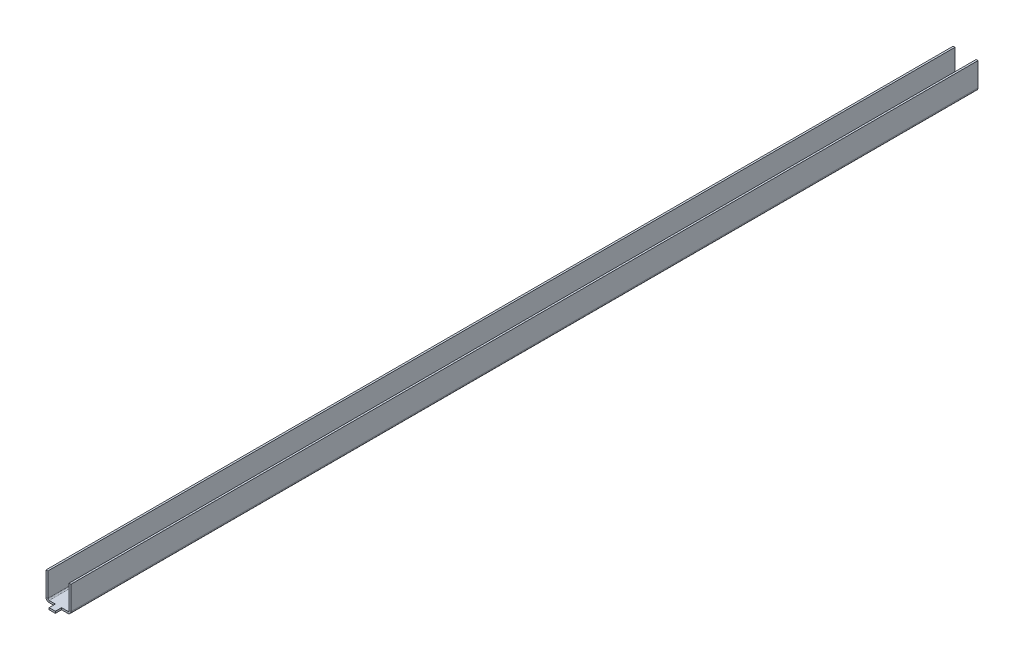
ISO-10303-21;
HEADER;
FILE_DESCRIPTION(('STEP AP214'),'2;1');
FILE_NAME('part.step','',(''),(''),'','','');
FILE_SCHEMA(('AUTOMOTIVE_DESIGN { 1 0 10303 214 1 1 1 1 }'));
ENDSEC;
DATA;
#1=APPLICATION_CONTEXT('core data for automotive mechanical design processes');
#2=APPLICATION_PROTOCOL_DEFINITION('international standard','automotive_design',2000,#1);
#3=PRODUCT_CONTEXT('',#1,'mechanical');
#4=PRODUCT('Part','Part','',(#3));
#5=PRODUCT_RELATED_PRODUCT_CATEGORY('part','',(#4));
#6=PRODUCT_DEFINITION_FORMATION('','',#4);
#7=PRODUCT_DEFINITION_CONTEXT('part definition',#1,'design');
#8=PRODUCT_DEFINITION('design','',#6,#7);
#9=PRODUCT_DEFINITION_SHAPE('','',#8);
#10=(LENGTH_UNIT() NAMED_UNIT(*) SI_UNIT(.MILLI.,.METRE.));
#11=(NAMED_UNIT(*) PLANE_ANGLE_UNIT() SI_UNIT($,.RADIAN.));
#12=(NAMED_UNIT(*) SI_UNIT($,.STERADIAN.) SOLID_ANGLE_UNIT());
#13=UNCERTAINTY_MEASURE_WITH_UNIT(LENGTH_MEASURE(1.E-05),#10,'distance_accuracy_value','');
#14=(GEOMETRIC_REPRESENTATION_CONTEXT(3) GLOBAL_UNCERTAINTY_ASSIGNED_CONTEXT((#13)) GLOBAL_UNIT_ASSIGNED_CONTEXT((#10,
#11,#12)) REPRESENTATION_CONTEXT('',''));
#15=CARTESIAN_POINT('',(0.,0.,0.));
#16=DIRECTION('',(0.,0.,1.));
#17=DIRECTION('',(1.,0.,0.));
#18=AXIS2_PLACEMENT_3D('',#15,#16,#17);
#19=CARTESIAN_POINT('',(1448.99545453837,-1.50000000000008,-26.7842712474617));
#20=DIRECTION('',(0.,1.,0.));
#21=DIRECTION('',(-1.,0.,0.));
#22=AXIS2_PLACEMENT_3D('',#19,#20,#21);
#23=PLANE('',#22);
#24=DIRECTION('',(-1.,0.,0.));
#25=VECTOR('',#24,1.);
#26=CARTESIAN_POINT('',(1448.99545453837,-1.50000000000008,1.5));
#27=LINE('',#26,#25);
#28=CARTESIAN_POINT('',(-8.49999999999999,-1.49999999999983,1.5));
#29=VERTEX_POINT('',#28);
#30=CARTESIAN_POINT('',(-9.99999999999958,-1.49999999999983,1.5));
#31=VERTEX_POINT('',#30);
#32=EDGE_CURVE('E107',#29,#31,#27,.T.);
#33=ORIENTED_EDGE('',*,*,#32,.T.);
#34=DIRECTION('',(0.,0.,1.));
#35=VECTOR('',#34,1.);
#36=CARTESIAN_POINT('',(-9.99999999999998,-1.49999999999983,-26.7842712474617));
#37=LINE('',#36,#35);
#38=CARTESIAN_POINT('',(-9.99999999999998,-1.49999999999983,730.));
#39=VERTEX_POINT('',#38);
#40=EDGE_CURVE('E561',#31,#39,#37,.T.);
#41=ORIENTED_EDGE('',*,*,#40,.T.);
#42=DIRECTION('',(-1.,0.,0.));
#43=VECTOR('',#42,1.);
#44=CARTESIAN_POINT('',(1448.99545453837,-1.50000000000008,730.));
#45=LINE('',#44,#43);
#46=CARTESIAN_POINT('',(-8.49999999999952,-1.49999999999983,730.));
#47=VERTEX_POINT('',#46);
#48=EDGE_CURVE('E400',#47,#39,#45,.T.);
#49=ORIENTED_EDGE('',*,*,#48,.F.);
#50=DIRECTION('',(0.,0.,1.));
#51=VECTOR('',#50,1.);
#52=CARTESIAN_POINT('',(-8.49999999999999,-1.49999999999983,-26.7842712474617));
#53=LINE('',#52,#51);
#54=EDGE_CURVE('E559',#47,#29,#53,.F.);
#55=ORIENTED_EDGE('',*,*,#54,.T.);
#56=EDGE_LOOP('',(#33,#41,#49,#55));
#57=FACE_BOUND('',#56,.T.);
#58=ADVANCED_FACE('F53',(#57),#23,.T.);
#59=CARTESIAN_POINT('',(1448.99545453837,-1.50000000000008,1.5));
#60=DIRECTION('',(0.,0.,-1.));
#61=DIRECTION('',(1.,0.,0.));
#62=AXIS2_PLACEMENT_3D('',#59,#60,#61);
#63=PLANE('',#62);
#64=DIRECTION('',(-1.,0.,0.));
#65=VECTOR('',#64,1.);
#66=CARTESIAN_POINT('',(1448.99545453837,-20.5000000000001,1.49999999999997));
#67=LINE('',#66,#65);
#68=CARTESIAN_POINT('',(-8.49999999999952,-20.4999999999998,1.49999999999997));
#69=VERTEX_POINT('',#68);
#70=CARTESIAN_POINT('',(-9.99999999999999,-20.4999999999998,1.49999999999995));
#71=VERTEX_POINT('',#70);
#72=EDGE_CURVE('E557',#69,#71,#67,.T.);
#73=ORIENTED_EDGE('',*,*,#72,.T.);
#74=DIRECTION('',(0.,-1.,0.));
#75=VECTOR('',#74,1.);
#76=CARTESIAN_POINT('',(-9.99999999999998,-1.49999999999993,1.5));
#77=LINE('',#76,#75);
#78=EDGE_CURVE('E403',#31,#71,#77,.T.);
#79=ORIENTED_EDGE('',*,*,#78,.F.);
#80=ORIENTED_EDGE('',*,*,#32,.F.);
#81=DIRECTION('',(0.,-1.,0.));
#82=VECTOR('',#81,1.);
#83=CARTESIAN_POINT('',(-8.49999999999999,-1.49999999999983,1.5));
#84=LINE('',#83,#82);
#85=EDGE_CURVE('E104',#29,#69,#84,.T.);
#86=ORIENTED_EDGE('',*,*,#85,.T.);
#87=EDGE_LOOP('',(#73,#79,#80,#86));
#88=FACE_BOUND('',#87,.T.);
#89=ADVANCED_FACE('F598',(#88),#63,.T.);
#90=CARTESIAN_POINT('',(-9.99999999999998,-1.49999999999983,-26.7842712474617));
#91=DIRECTION('',(-1.,0.,0.));
#92=DIRECTION('',(0.,-1.,0.));
#93=AXIS2_PLACEMENT_3D('',#90,#91,#92);
#94=PLANE('',#93);
#95=DIRECTION('',(0.,0.,1.));
#96=VECTOR('',#95,1.);
#97=CARTESIAN_POINT('',(-9.99999999999999,-20.4999999999998,-26.7842712474617));
#98=LINE('',#97,#96);
#99=CARTESIAN_POINT('',(-9.99999999999999,-20.4999999999998,730.));
#100=VERTEX_POINT('',#99);
#101=EDGE_CURVE('E272',#100,#71,#98,.F.);
#102=ORIENTED_EDGE('',*,*,#101,.F.);
#103=DIRECTION('',(0.,1.,0.));
#104=VECTOR('',#103,1.);
#105=CARTESIAN_POINT('',(-9.99999999999999,-19.9999999999998,730.));
#106=LINE('',#105,#104);
#107=EDGE_CURVE('E397',#39,#100,#106,.F.);
#108=ORIENTED_EDGE('',*,*,#107,.F.);
#109=ORIENTED_EDGE('',*,*,#40,.F.);
#110=ORIENTED_EDGE('',*,*,#78,.T.);
#111=EDGE_LOOP('',(#102,#108,#109,#110));
#112=FACE_BOUND('',#111,.T.);
#113=ADVANCED_FACE('F597',(#112),#94,.T.);
#114=CARTESIAN_POINT('',(1448.99545453837,-1.50000000000008,730.));
#115=DIRECTION('',(0.,0.,1.));
#116=DIRECTION('',(-1.,0.,0.));
#117=AXIS2_PLACEMENT_3D('',#114,#115,#116);
#118=PLANE('',#117);
#119=ORIENTED_EDGE('',*,*,#48,.T.);
#120=ORIENTED_EDGE('',*,*,#107,.T.);
#121=DIRECTION('',(-1.,0.,0.));
#122=VECTOR('',#121,1.);
#123=CARTESIAN_POINT('',(1448.99545453837,-20.5000000000001,730.));
#124=LINE('',#123,#122);
#125=CARTESIAN_POINT('',(-8.49999999999952,-20.4999999999998,730.));
#126=VERTEX_POINT('',#125);
#127=EDGE_CURVE('E58',#126,#100,#124,.T.);
#128=ORIENTED_EDGE('',*,*,#127,.F.);
#129=DIRECTION('',(0.,-1.,0.));
#130=VECTOR('',#129,1.);
#131=CARTESIAN_POINT('',(-8.49999999999999,-1.49999999999983,730.));
#132=LINE('',#131,#130);
#133=EDGE_CURVE('E65',#126,#47,#132,.F.);
#134=ORIENTED_EDGE('',*,*,#133,.T.);
#135=EDGE_LOOP('',(#119,#120,#128,#134));
#136=FACE_BOUND('',#135,.T.);
#137=ADVANCED_FACE('F591',(#136),#118,.T.);
#138=CARTESIAN_POINT('',(-8.49999999999999,-1.49999999999983,-26.7842712474617));
#139=DIRECTION('',(-1.,0.,0.));
#140=DIRECTION('',(0.,-1.,0.));
#141=AXIS2_PLACEMENT_3D('',#138,#139,#140);
#142=PLANE('',#141);
#143=ORIENTED_EDGE('',*,*,#54,.F.);
#144=ORIENTED_EDGE('',*,*,#133,.F.);
#145=DIRECTION('',(0.,0.,1.));
#146=VECTOR('',#145,1.);
#147=CARTESIAN_POINT('',(-8.49999999999999,-20.4999999999998,-26.7842712474617));
#148=LINE('',#147,#146);
#149=EDGE_CURVE('E12',#126,#69,#148,.F.);
#150=ORIENTED_EDGE('',*,*,#149,.T.);
#151=ORIENTED_EDGE('',*,*,#85,.F.);
#152=EDGE_LOOP('',(#143,#144,#150,#151));
#153=FACE_BOUND('',#152,.T.);
#154=ADVANCED_FACE('F56',(#153),#142,.F.);
#155=CARTESIAN_POINT('',(10.,-22.9999999999998,-26.7842712474617));
#156=DIRECTION('',(0.,-1.,0.));
#157=DIRECTION('',(0.,0.,-1.));
#158=AXIS2_PLACEMENT_3D('',#155,#156,#157);
#159=PLANE('',#158);
#160=DIRECTION('',(0.,0.,1.));
#161=VECTOR('',#160,1.);
#162=CARTESIAN_POINT('',(7.5,-22.9999999999998,-26.7842712474617));
#163=LINE('',#162,#161);
#164=CARTESIAN_POINT('',(7.5,-22.9999999999998,730.));
#165=VERTEX_POINT('',#164);
#166=CARTESIAN_POINT('',(7.49999999999999,-22.9999999999998,1.49999999999995));
#167=VERTEX_POINT('',#166);
#168=EDGE_CURVE('E442',#165,#167,#163,.F.);
#169=ORIENTED_EDGE('',*,*,#168,.F.);
#170=DIRECTION('',(1.,0.,0.));
#171=VECTOR('',#170,1.);
#172=CARTESIAN_POINT('',(8.5,-22.9999999999998,730.));
#173=LINE('',#172,#171);
#174=CARTESIAN_POINT('',(2.5,-22.9999999999998,730.));
#175=VERTEX_POINT('',#174);
#176=EDGE_CURVE('E445',#175,#165,#173,.T.);
#177=ORIENTED_EDGE('',*,*,#176,.F.);
#178=DIRECTION('',(0.,0.,1.));
#179=VECTOR('',#178,1.);
#180=CARTESIAN_POINT('',(2.5,-22.9999999999998,730.));
#181=LINE('',#180,#179);
#182=CARTESIAN_POINT('',(2.5,-22.9999999999998,735.));
#183=VERTEX_POINT('',#182);
#184=EDGE_CURVE('E450',#175,#183,#181,.T.);
#185=ORIENTED_EDGE('',*,*,#184,.T.);
#186=DIRECTION('',(-1.,0.,0.));
#187=VECTOR('',#186,1.);
#188=CARTESIAN_POINT('',(2.5,-22.9999999999998,735.));
#189=LINE('',#188,#187);
#190=CARTESIAN_POINT('',(-2.5,-22.9999999999998,735.));
#191=VERTEX_POINT('',#190);
#192=EDGE_CURVE('E465',#183,#191,#189,.T.);
#193=ORIENTED_EDGE('',*,*,#192,.T.);
#194=DIRECTION('',(0.,0.,-1.));
#195=VECTOR('',#194,1.);
#196=CARTESIAN_POINT('',(-2.5,-22.9999999999998,730.));
#197=LINE('',#196,#195);
#198=CARTESIAN_POINT('',(-2.5,-22.9999999999998,730.));
#199=VERTEX_POINT('',#198);
#200=EDGE_CURVE('E462',#191,#199,#197,.T.);
#201=ORIENTED_EDGE('',*,*,#200,.T.);
#202=CARTESIAN_POINT('',(-7.5,-22.9999999999998,730.));
#203=VERTEX_POINT('',#202);
#204=EDGE_CURVE('E284',#203,#199,#173,.T.);
#205=ORIENTED_EDGE('',*,*,#204,.F.);
#206=DIRECTION('',(0.,0.,-1.));
#207=VECTOR('',#206,1.);
#208=CARTESIAN_POINT('',(-7.5,-22.9999999999998,-26.7842712474617));
#209=LINE('',#208,#207);
#210=CARTESIAN_POINT('',(-7.5,-22.9999999999998,1.49999999999995));
#211=VERTEX_POINT('',#210);
#212=EDGE_CURVE('E269',#203,#211,#209,.T.);
#213=ORIENTED_EDGE('',*,*,#212,.T.);
#214=DIRECTION('',(1.,0.,0.));
#215=VECTOR('',#214,1.);
#216=CARTESIAN_POINT('',(10.,-22.9999999999998,1.49999999999994));
#217=LINE('',#216,#215);
#218=CARTESIAN_POINT('',(-2.5,-22.9999999999998,1.49999999999994));
#219=VERTEX_POINT('',#218);
#220=EDGE_CURVE('E281',#211,#219,#217,.T.);
#221=ORIENTED_EDGE('',*,*,#220,.T.);
#222=DIRECTION('',(0.,0.,-1.));
#223=VECTOR('',#222,1.);
#224=CARTESIAN_POINT('',(-2.5,-22.9999999999998,1.49999999999993));
#225=LINE('',#224,#223);
#226=CARTESIAN_POINT('',(-2.5,-22.9999999999998,-2.61726404438001E-13));
#227=VERTEX_POINT('',#226);
#228=EDGE_CURVE('E292',#219,#227,#225,.T.);
#229=ORIENTED_EDGE('',*,*,#228,.T.);
#230=DIRECTION('',(1.,0.,0.));
#231=VECTOR('',#230,1.);
#232=CARTESIAN_POINT('',(2.5,-22.9999999999998,-2.61075883134509E-13));
#233=LINE('',#232,#231);
#234=CARTESIAN_POINT('',(2.5,-22.9999999999998,-2.61075883134509E-13));
#235=VERTEX_POINT('',#234);
#236=EDGE_CURVE('E296',#227,#235,#233,.T.);
#237=ORIENTED_EDGE('',*,*,#236,.T.);
#238=DIRECTION('',(0.,0.,1.));
#239=VECTOR('',#238,1.);
#240=CARTESIAN_POINT('',(2.5,-22.9999999999998,1.49999999999994));
#241=LINE('',#240,#239);
#242=CARTESIAN_POINT('',(2.5,-22.9999999999998,1.49999999999994));
#243=VERTEX_POINT('',#242);
#244=EDGE_CURVE('E302',#235,#243,#241,.T.);
#245=ORIENTED_EDGE('',*,*,#244,.T.);
#246=EDGE_CURVE('E294',#243,#167,#217,.T.);
#247=ORIENTED_EDGE('',*,*,#246,.T.);
#248=EDGE_LOOP('',(#169,#177,#185,#193,#201,#205,#213,#221,#229,#237,#245,#247));
#249=FACE_BOUND('',#248,.T.);
#250=ADVANCED_FACE('F280',(#249),#159,.T.);
#251=CARTESIAN_POINT('',(10.,1448.80609058114,730.));
#252=DIRECTION('',(0.,0.,1.));
#253=DIRECTION('',(0.,-1.,0.));
#254=AXIS2_PLACEMENT_3D('',#251,#252,#253);
#255=PLANE('',#254);
#256=DIRECTION('',(0.,-1.,0.));
#257=VECTOR('',#256,1.);
#258=CARTESIAN_POINT('',(-7.5,1448.80609058114,730.));
#259=LINE('',#258,#257);
#260=CARTESIAN_POINT('',(-7.5,-21.4999999999998,730.));
#261=VERTEX_POINT('',#260);
#262=EDGE_CURVE('E392',#261,#203,#259,.T.);
#263=ORIENTED_EDGE('',*,*,#262,.T.);
#264=ORIENTED_EDGE('',*,*,#204,.T.);
#265=DIRECTION('',(0.,-1.,0.));
#266=VECTOR('',#265,1.);
#267=CARTESIAN_POINT('',(-2.5,1448.80609058114,730.));
#268=LINE('',#267,#266);
#269=CARTESIAN_POINT('',(-2.5,-21.4999999999998,730.));
#270=VERTEX_POINT('',#269);
#271=EDGE_CURVE('E389',#270,#199,#268,.T.);
#272=ORIENTED_EDGE('',*,*,#271,.F.);
#273=DIRECTION('',(1.,0.,0.));
#274=VECTOR('',#273,1.);
#275=CARTESIAN_POINT('',(10.,-21.4999999999998,730.));
#276=LINE('',#275,#274);
#277=EDGE_CURVE('E307',#270,#261,#276,.F.);
#278=ORIENTED_EDGE('',*,*,#277,.T.);
#279=EDGE_LOOP('',(#263,#264,#272,#278));
#280=FACE_BOUND('',#279,.T.);
#281=ADVANCED_FACE('F578',(#280),#255,.T.);
#282=CARTESIAN_POINT('',(-2.5,1448.80609058114,730.));
#283=DIRECTION('',(-1.,0.,0.));
#284=DIRECTION('',(0.,-1.,0.));
#285=AXIS2_PLACEMENT_3D('',#282,#283,#284);
#286=PLANE('',#285);
#287=ORIENTED_EDGE('',*,*,#271,.T.);
#288=ORIENTED_EDGE('',*,*,#200,.F.);
#289=DIRECTION('',(0.,-1.,0.));
#290=VECTOR('',#289,1.);
#291=CARTESIAN_POINT('',(-2.5,1448.80609058114,735.));
#292=LINE('',#291,#290);
#293=CARTESIAN_POINT('',(-2.5,-21.4999999999998,735.));
#294=VERTEX_POINT('',#293);
#295=EDGE_CURVE('E386',#294,#191,#292,.T.);
#296=ORIENTED_EDGE('',*,*,#295,.F.);
#297=DIRECTION('',(0.,0.,-1.));
#298=VECTOR('',#297,1.);
#299=CARTESIAN_POINT('',(-2.5,-21.4999999999998,730.));
#300=LINE('',#299,#298);
#301=EDGE_CURVE('E119',#294,#270,#300,.T.);
#302=ORIENTED_EDGE('',*,*,#301,.T.);
#303=EDGE_LOOP('',(#287,#288,#296,#302));
#304=FACE_BOUND('',#303,.T.);
#305=ADVANCED_FACE('F620',(#304),#286,.T.);
#306=CARTESIAN_POINT('',(2.5,1448.80609058114,735.));
#307=DIRECTION('',(0.,0.,1.));
#308=DIRECTION('',(0.,-1.,0.));
#309=AXIS2_PLACEMENT_3D('',#306,#307,#308);
#310=PLANE('',#309);
#311=ORIENTED_EDGE('',*,*,#295,.T.);
#312=ORIENTED_EDGE('',*,*,#192,.F.);
#313=DIRECTION('',(0.,-1.,0.));
#314=VECTOR('',#313,1.);
#315=CARTESIAN_POINT('',(2.5,1448.80609058114,735.));
#316=LINE('',#315,#314);
#317=CARTESIAN_POINT('',(2.5,-21.4999999999998,735.));
#318=VERTEX_POINT('',#317);
#319=EDGE_CURVE('E382',#318,#183,#316,.T.);
#320=ORIENTED_EDGE('',*,*,#319,.F.);
#321=DIRECTION('',(-1.,0.,0.));
#322=VECTOR('',#321,1.);
#323=CARTESIAN_POINT('',(2.5,-21.4999999999998,735.));
#324=LINE('',#323,#322);
#325=EDGE_CURVE('E129',#318,#294,#324,.T.);
#326=ORIENTED_EDGE('',*,*,#325,.T.);
#327=EDGE_LOOP('',(#311,#312,#320,#326));
#328=FACE_BOUND('',#327,.T.);
#329=ADVANCED_FACE('F650',(#328),#310,.T.);
#330=CARTESIAN_POINT('',(2.5,1448.80609058114,730.));
#331=DIRECTION('',(1.,0.,0.));
#332=DIRECTION('',(0.,1.,0.));
#333=AXIS2_PLACEMENT_3D('',#330,#331,#332);
#334=PLANE('',#333);
#335=ORIENTED_EDGE('',*,*,#319,.T.);
#336=ORIENTED_EDGE('',*,*,#184,.F.);
#337=DIRECTION('',(0.,-1.,0.));
#338=VECTOR('',#337,1.);
#339=CARTESIAN_POINT('',(2.5,1448.80609058114,730.));
#340=LINE('',#339,#338);
#341=CARTESIAN_POINT('',(2.5,-21.4999999999998,730.));
#342=VERTEX_POINT('',#341);
#343=EDGE_CURVE('E378',#342,#175,#340,.T.);
#344=ORIENTED_EDGE('',*,*,#343,.F.);
#345=DIRECTION('',(0.,0.,1.));
#346=VECTOR('',#345,1.);
#347=CARTESIAN_POINT('',(2.5,-21.4999999999998,730.));
#348=LINE('',#347,#346);
#349=EDGE_CURVE('E331',#342,#318,#348,.T.);
#350=ORIENTED_EDGE('',*,*,#349,.T.);
#351=EDGE_LOOP('',(#335,#336,#344,#350));
#352=FACE_BOUND('',#351,.T.);
#353=ADVANCED_FACE('F647',(#352),#334,.T.);
#354=ORIENTED_EDGE('',*,*,#343,.T.);
#355=ORIENTED_EDGE('',*,*,#176,.T.);
#356=DIRECTION('',(0.,-1.,0.));
#357=VECTOR('',#356,1.);
#358=CARTESIAN_POINT('',(7.5,1448.80609058114,730.));
#359=LINE('',#358,#357);
#360=CARTESIAN_POINT('',(7.5,-21.4999999999998,730.));
#361=VERTEX_POINT('',#360);
#362=EDGE_CURVE('E374',#361,#165,#359,.T.);
#363=ORIENTED_EDGE('',*,*,#362,.F.);
#364=EDGE_CURVE('E335',#361,#342,#276,.F.);
#365=ORIENTED_EDGE('',*,*,#364,.T.);
#366=EDGE_LOOP('',(#354,#355,#363,#365));
#367=FACE_BOUND('',#366,.T.);
#368=ADVANCED_FACE('F622',(#367),#255,.T.);
#369=CARTESIAN_POINT('',(10.,1448.80609058114,1.49999999999994));
#370=DIRECTION('',(0.,0.,-1.));
#371=DIRECTION('',(0.,1.,0.));
#372=AXIS2_PLACEMENT_3D('',#369,#370,#371);
#373=PLANE('',#372);
#374=DIRECTION('',(0.,-1.,0.));
#375=VECTOR('',#374,1.);
#376=CARTESIAN_POINT('',(7.5,1448.80609058114,1.49999999999994));
#377=LINE('',#376,#375);
#378=CARTESIAN_POINT('',(7.5,-21.4999999999998,1.49999999999994));
#379=VERTEX_POINT('',#378);
#380=EDGE_CURVE('E371',#379,#167,#377,.T.);
#381=ORIENTED_EDGE('',*,*,#380,.T.);
#382=ORIENTED_EDGE('',*,*,#246,.F.);
#383=DIRECTION('',(0.,-1.,0.));
#384=VECTOR('',#383,1.);
#385=CARTESIAN_POINT('',(2.5,1448.80609058114,1.49999999999994));
#386=LINE('',#385,#384);
#387=CARTESIAN_POINT('',(2.5,-21.4999999999998,1.49999999999994));
#388=VERTEX_POINT('',#387);
#389=EDGE_CURVE('E367',#388,#243,#386,.T.);
#390=ORIENTED_EDGE('',*,*,#389,.F.);
#391=DIRECTION('',(1.,0.,0.));
#392=VECTOR('',#391,1.);
#393=CARTESIAN_POINT('',(10.,-21.4999999999998,1.49999999999994));
#394=LINE('',#393,#392);
#395=EDGE_CURVE('E341',#388,#379,#394,.T.);
#396=ORIENTED_EDGE('',*,*,#395,.T.);
#397=EDGE_LOOP('',(#381,#382,#390,#396));
#398=FACE_BOUND('',#397,.T.);
#399=ADVANCED_FACE('F631',(#398),#373,.T.);
#400=CARTESIAN_POINT('',(2.5,1448.80609058114,1.49999999999994));
#401=DIRECTION('',(1.,0.,0.));
#402=DIRECTION('',(0.,1.,0.));
#403=AXIS2_PLACEMENT_3D('',#400,#401,#402);
#404=PLANE('',#403);
#405=ORIENTED_EDGE('',*,*,#389,.T.);
#406=ORIENTED_EDGE('',*,*,#244,.F.);
#407=DIRECTION('',(0.,-1.,0.));
#408=VECTOR('',#407,1.);
#409=CARTESIAN_POINT('',(2.5,1448.80609058114,-2.61075883134509E-13));
#410=LINE('',#409,#408);
#411=CARTESIAN_POINT('',(2.5,-21.4999999999998,-2.61075883134509E-13));
#412=VERTEX_POINT('',#411);
#413=EDGE_CURVE('E363',#412,#235,#410,.T.);
#414=ORIENTED_EDGE('',*,*,#413,.F.);
#415=DIRECTION('',(0.,0.,1.));
#416=VECTOR('',#415,1.);
#417=CARTESIAN_POINT('',(2.5,-21.4999999999998,1.49999999999994));
#418=LINE('',#417,#416);
#419=EDGE_CURVE('E344',#412,#388,#418,.T.);
#420=ORIENTED_EDGE('',*,*,#419,.T.);
#421=EDGE_LOOP('',(#405,#406,#414,#420));
#422=FACE_BOUND('',#421,.T.);
#423=ADVANCED_FACE('F634',(#422),#404,.T.);
#424=CARTESIAN_POINT('',(2.5,1448.80609058114,-2.61075883134509E-13));
#425=DIRECTION('',(0.,0.,-1.));
#426=DIRECTION('',(1.,0.,0.));
#427=AXIS2_PLACEMENT_3D('',#424,#425,#426);
#428=PLANE('',#427);
#429=ORIENTED_EDGE('',*,*,#413,.T.);
#430=ORIENTED_EDGE('',*,*,#236,.F.);
#431=DIRECTION('',(0.,-1.,0.));
#432=VECTOR('',#431,1.);
#433=CARTESIAN_POINT('',(-2.5,1448.80609058114,-2.61726404438001E-13));
#434=LINE('',#433,#432);
#435=CARTESIAN_POINT('',(-2.5,-21.4999999999998,-2.61726404438001E-13));
#436=VERTEX_POINT('',#435);
#437=EDGE_CURVE('E359',#436,#227,#434,.T.);
#438=ORIENTED_EDGE('',*,*,#437,.F.);
#439=DIRECTION('',(1.,0.,0.));
#440=VECTOR('',#439,1.);
#441=CARTESIAN_POINT('',(2.5,-21.4999999999998,-2.61075883134509E-13));
#442=LINE('',#441,#440);
#443=EDGE_CURVE('E349',#436,#412,#442,.T.);
#444=ORIENTED_EDGE('',*,*,#443,.T.);
#445=EDGE_LOOP('',(#429,#430,#438,#444));
#446=FACE_BOUND('',#445,.T.);
#447=ADVANCED_FACE('F639',(#446),#428,.T.);
#448=CARTESIAN_POINT('',(-2.5,1448.80609058114,1.49999999999993));
#449=DIRECTION('',(-1.,0.,0.));
#450=DIRECTION('',(0.,-1.,0.));
#451=AXIS2_PLACEMENT_3D('',#448,#449,#450);
#452=PLANE('',#451);
#453=ORIENTED_EDGE('',*,*,#437,.T.);
#454=ORIENTED_EDGE('',*,*,#228,.F.);
#455=DIRECTION('',(0.,-1.,0.));
#456=VECTOR('',#455,1.);
#457=CARTESIAN_POINT('',(-2.5,1448.80609058114,1.49999999999993));
#458=LINE('',#457,#456);
#459=CARTESIAN_POINT('',(-2.5,-21.4999999999998,1.49999999999993));
#460=VERTEX_POINT('',#459);
#461=EDGE_CURVE('E261',#460,#219,#458,.T.);
#462=ORIENTED_EDGE('',*,*,#461,.F.);
#463=DIRECTION('',(0.,0.,-1.));
#464=VECTOR('',#463,1.);
#465=CARTESIAN_POINT('',(-2.5,-21.4999999999998,1.49999999999993));
#466=LINE('',#465,#464);
#467=EDGE_CURVE('E353',#460,#436,#466,.T.);
#468=ORIENTED_EDGE('',*,*,#467,.T.);
#469=EDGE_LOOP('',(#453,#454,#462,#468));
#470=FACE_BOUND('',#469,.T.);
#471=ADVANCED_FACE('F636',(#470),#452,.T.);
#472=ORIENTED_EDGE('',*,*,#461,.T.);
#473=ORIENTED_EDGE('',*,*,#220,.F.);
#474=DIRECTION('',(0.,-1.,0.));
#475=VECTOR('',#474,1.);
#476=CARTESIAN_POINT('',(-7.5,1448.80609058114,1.49999999999994));
#477=LINE('',#476,#475);
#478=CARTESIAN_POINT('',(-7.5,-21.4999999999998,1.49999999999995));
#479=VERTEX_POINT('',#478);
#480=EDGE_CURVE('E250',#479,#211,#477,.T.);
#481=ORIENTED_EDGE('',*,*,#480,.F.);
#482=EDGE_CURVE('E262',#479,#460,#394,.T.);
#483=ORIENTED_EDGE('',*,*,#482,.T.);
#484=EDGE_LOOP('',(#472,#473,#481,#483));
#485=FACE_BOUND('',#484,.T.);
#486=ADVANCED_FACE('F289',(#485),#373,.T.);
#487=CARTESIAN_POINT('',(10.,-21.4999999999998,-26.7842712474617));
#488=DIRECTION('',(0.,-1.,0.));
#489=DIRECTION('',(0.,0.,-1.));
#490=AXIS2_PLACEMENT_3D('',#487,#488,#489);
#491=PLANE('',#490);
#492=DIRECTION('',(0.,0.,-1.));
#493=VECTOR('',#492,1.);
#494=CARTESIAN_POINT('',(-7.5,-21.4999999999998,-26.7842712474617));
#495=LINE('',#494,#493);
#496=EDGE_CURVE('E301',#261,#479,#495,.T.);
#497=ORIENTED_EDGE('',*,*,#496,.F.);
#498=ORIENTED_EDGE('',*,*,#277,.F.);
#499=ORIENTED_EDGE('',*,*,#301,.F.);
#500=ORIENTED_EDGE('',*,*,#325,.F.);
#501=ORIENTED_EDGE('',*,*,#349,.F.);
#502=ORIENTED_EDGE('',*,*,#364,.F.);
#503=DIRECTION('',(0.,0.,1.));
#504=VECTOR('',#503,1.);
#505=CARTESIAN_POINT('',(7.5,-21.4999999999998,-26.7842712474617));
#506=LINE('',#505,#504);
#507=EDGE_CURVE('E336',#361,#379,#506,.F.);
#508=ORIENTED_EDGE('',*,*,#507,.T.);
#509=ORIENTED_EDGE('',*,*,#395,.F.);
#510=ORIENTED_EDGE('',*,*,#419,.F.);
#511=ORIENTED_EDGE('',*,*,#443,.F.);
#512=ORIENTED_EDGE('',*,*,#467,.F.);
#513=ORIENTED_EDGE('',*,*,#482,.F.);
#514=EDGE_LOOP('',(#497,#498,#499,#500,#501,#502,#508,#509,#510,#511,#512,#513));
#515=FACE_BOUND('',#514,.T.);
#516=ADVANCED_FACE('F581',(#515),#491,.F.);
#517=CARTESIAN_POINT('',(-1448.99545453837,-1.49999999999895,-26.7842712474617));
#518=DIRECTION('',(0.,1.,0.));
#519=DIRECTION('',(-1.,0.,0.));
#520=AXIS2_PLACEMENT_3D('',#517,#518,#519);
#521=PLANE('',#520);
#522=DIRECTION('',(1.,0.,0.));
#523=VECTOR('',#522,1.);
#524=CARTESIAN_POINT('',(-1448.99545453837,-1.49999999999895,730.));
#525=LINE('',#524,#523);
#526=CARTESIAN_POINT('',(8.49999999999951,-1.49999999999983,730.));
#527=VERTEX_POINT('',#526);
#528=CARTESIAN_POINT('',(10.,-1.49999999999983,730.));
#529=VERTEX_POINT('',#528);
#530=EDGE_CURVE('E430',#527,#529,#525,.T.);
#531=ORIENTED_EDGE('',*,*,#530,.T.);
#532=DIRECTION('',(0.,0.,1.));
#533=VECTOR('',#532,1.);
#534=CARTESIAN_POINT('',(10.,-1.49999999999983,-26.7842712474617));
#535=LINE('',#534,#533);
#536=CARTESIAN_POINT('',(10.,-1.49999999999983,1.49999999999997));
#537=VERTEX_POINT('',#536);
#538=EDGE_CURVE('E425',#529,#537,#535,.F.);
#539=ORIENTED_EDGE('',*,*,#538,.T.);
#540=DIRECTION('',(1.,0.,0.));
#541=VECTOR('',#540,1.);
#542=CARTESIAN_POINT('',(-1448.99545453837,-1.49999999999895,1.49999999999998));
#543=LINE('',#542,#541);
#544=CARTESIAN_POINT('',(8.49999999999951,-1.49999999999983,1.49999999999998));
#545=VERTEX_POINT('',#544);
#546=EDGE_CURVE('E500',#545,#537,#543,.T.);
#547=ORIENTED_EDGE('',*,*,#546,.F.);
#548=DIRECTION('',(0.,0.,1.));
#549=VECTOR('',#548,1.);
#550=CARTESIAN_POINT('',(8.50000000000001,-1.49999999999983,-26.7842712474617));
#551=LINE('',#550,#549);
#552=EDGE_CURVE('E419',#545,#527,#551,.T.);
#553=ORIENTED_EDGE('',*,*,#552,.T.);
#554=EDGE_LOOP('',(#531,#539,#547,#553));
#555=FACE_BOUND('',#554,.T.);
#556=ADVANCED_FACE('F537',(#555),#521,.T.);
#557=CARTESIAN_POINT('',(8.50000000000001,-1.49999999999983,-26.7842712474617));
#558=DIRECTION('',(1.,0.,0.));
#559=DIRECTION('',(0.,1.,0.));
#560=AXIS2_PLACEMENT_3D('',#557,#558,#559);
#561=PLANE('',#560);
#562=DIRECTION('',(0.,0.,1.));
#563=VECTOR('',#562,1.);
#564=CARTESIAN_POINT('',(8.5,-20.4999999999998,-26.7842712474617));
#565=LINE('',#564,#563);
#566=CARTESIAN_POINT('',(8.5,-20.4999999999998,730.));
#567=VERTEX_POINT('',#566);
#568=CARTESIAN_POINT('',(8.5,-20.4999999999998,1.49999999999995));
#569=VERTEX_POINT('',#568);
#570=EDGE_CURVE('E437',#567,#569,#565,.F.);
#571=ORIENTED_EDGE('',*,*,#570,.F.);
#572=DIRECTION('',(0.,1.,0.));
#573=VECTOR('',#572,1.);
#574=CARTESIAN_POINT('',(8.50000000000001,-1.49999999999983,730.));
#575=LINE('',#574,#573);
#576=EDGE_CURVE('E489',#527,#567,#575,.F.);
#577=ORIENTED_EDGE('',*,*,#576,.F.);
#578=ORIENTED_EDGE('',*,*,#552,.F.);
#579=DIRECTION('',(0.,1.,0.));
#580=VECTOR('',#579,1.);
#581=CARTESIAN_POINT('',(8.50000000000001,-1.49999999999983,1.49999999999994));
#582=LINE('',#581,#580);
#583=EDGE_CURVE('E446',#569,#545,#582,.T.);
#584=ORIENTED_EDGE('',*,*,#583,.F.);
#585=EDGE_LOOP('',(#571,#577,#578,#584));
#586=FACE_BOUND('',#585,.T.);
#587=ADVANCED_FACE('F542',(#586),#561,.F.);
#588=CARTESIAN_POINT('',(-1448.99545453837,-1.49999999999895,730.));
#589=DIRECTION('',(0.,0.,1.));
#590=DIRECTION('',(1.,0.,0.));
#591=AXIS2_PLACEMENT_3D('',#588,#589,#590);
#592=PLANE('',#591);
#593=DIRECTION('',(1.,0.,0.));
#594=VECTOR('',#593,1.);
#595=CARTESIAN_POINT('',(-1448.99545453837,-20.499999999999,730.));
#596=LINE('',#595,#594);
#597=CARTESIAN_POINT('',(10.,-20.4999999999998,730.));
#598=VERTEX_POINT('',#597);
#599=EDGE_CURVE('E424',#567,#598,#596,.T.);
#600=ORIENTED_EDGE('',*,*,#599,.T.);
#601=DIRECTION('',(0.,1.,0.));
#602=VECTOR('',#601,1.);
#603=CARTESIAN_POINT('',(10.,-18.9999999999998,730.));
#604=LINE('',#603,#602);
#605=EDGE_CURVE('E484',#598,#529,#604,.T.);
#606=ORIENTED_EDGE('',*,*,#605,.T.);
#607=ORIENTED_EDGE('',*,*,#530,.F.);
#608=ORIENTED_EDGE('',*,*,#576,.T.);
#609=EDGE_LOOP('',(#600,#606,#607,#608));
#610=FACE_BOUND('',#609,.T.);
#611=ADVANCED_FACE('F544',(#610),#592,.T.);
#612=CARTESIAN_POINT('',(10.,-1.49999999999983,-26.7842712474617));
#613=DIRECTION('',(1.,0.,0.));
#614=DIRECTION('',(0.,1.,0.));
#615=AXIS2_PLACEMENT_3D('',#612,#613,#614);
#616=PLANE('',#615);
#617=ORIENTED_EDGE('',*,*,#538,.F.);
#618=ORIENTED_EDGE('',*,*,#605,.F.);
#619=DIRECTION('',(0.,0.,1.));
#620=VECTOR('',#619,1.);
#621=CARTESIAN_POINT('',(10.,-20.4999999999998,-26.7842712474617));
#622=LINE('',#621,#620);
#623=CARTESIAN_POINT('',(10.,-20.4999999999998,1.49999999999995));
#624=VERTEX_POINT('',#623);
#625=EDGE_CURVE('E493',#598,#624,#622,.F.);
#626=ORIENTED_EDGE('',*,*,#625,.T.);
#627=DIRECTION('',(0.,-1.,0.));
#628=VECTOR('',#627,1.);
#629=CARTESIAN_POINT('',(10.,-1.49999999999993,1.5));
#630=LINE('',#629,#628);
#631=EDGE_CURVE('E497',#624,#537,#630,.F.);
#632=ORIENTED_EDGE('',*,*,#631,.T.);
#633=EDGE_LOOP('',(#617,#618,#626,#632));
#634=FACE_BOUND('',#633,.T.);
#635=ADVANCED_FACE('F528',(#634),#616,.T.);
#636=CARTESIAN_POINT('',(-1448.99545453837,-1.49999999999895,1.49999999999994));
#637=DIRECTION('',(0.,0.,-1.));
#638=DIRECTION('',(-1.,0.,0.));
#639=AXIS2_PLACEMENT_3D('',#636,#637,#638);
#640=PLANE('',#639);
#641=ORIENTED_EDGE('',*,*,#546,.T.);
#642=ORIENTED_EDGE('',*,*,#631,.F.);
#643=DIRECTION('',(1.,0.,0.));
#644=VECTOR('',#643,1.);
#645=CARTESIAN_POINT('',(-1448.99545453837,-20.499999999999,1.49999999999994));
#646=LINE('',#645,#644);
#647=EDGE_CURVE('E434',#569,#624,#646,.T.);
#648=ORIENTED_EDGE('',*,*,#647,.F.);
#649=ORIENTED_EDGE('',*,*,#583,.T.);
#650=EDGE_LOOP('',(#641,#642,#648,#649));
#651=FACE_BOUND('',#650,.T.);
#652=ADVANCED_FACE('F532',(#651),#640,.T.);
#653=CARTESIAN_POINT('',(7.5,-20.4999999999998,1.49999999999995));
#654=DIRECTION('',(0.,0.,-1.));
#655=DIRECTION('',(-1.,0.,0.));
#656=AXIS2_PLACEMENT_3D('',#653,#654,#655);
#657=PLANE('',#656);
#658=ORIENTED_EDGE('',*,*,#380,.F.);
#659=CARTESIAN_POINT('',(7.5,-20.4999999999998,1.49999999999995));
#660=DIRECTION('',(0.,0.,1.));
#661=DIRECTION('',(1.,0.,0.));
#662=AXIS2_PLACEMENT_3D('',#659,#660,#661);
#663=CIRCLE('',#662,1.);
#664=EDGE_CURVE('E479',#379,#569,#663,.T.);
#665=ORIENTED_EDGE('',*,*,#664,.T.);
#666=ORIENTED_EDGE('',*,*,#647,.T.);
#667=CARTESIAN_POINT('',(7.5,-20.4999999999998,1.49999999999995));
#668=DIRECTION('',(0.,0.,1.));
#669=DIRECTION('',(1.,0.,0.));
#670=AXIS2_PLACEMENT_3D('',#667,#668,#669);
#671=CIRCLE('',#670,2.5);
#672=EDGE_CURVE('E509',#167,#624,#671,.T.);
#673=ORIENTED_EDGE('',*,*,#672,.F.);
#674=EDGE_LOOP('',(#658,#665,#666,#673));
#675=FACE_BOUND('',#674,.T.);
#676=ADVANCED_FACE('F731',(#675),#657,.T.);
#677=CARTESIAN_POINT('',(7.5,-20.4999999999998,730.));
#678=DIRECTION('',(0.,0.,1.));
#679=DIRECTION('',(1.,0.,0.));
#680=AXIS2_PLACEMENT_3D('',#677,#678,#679);
#681=PLANE('',#680);
#682=CARTESIAN_POINT('',(7.5,-20.4999999999998,730.));
#683=DIRECTION('',(0.,0.,1.));
#684=DIRECTION('',(1.,0.,0.));
#685=AXIS2_PLACEMENT_3D('',#682,#683,#684);
#686=CIRCLE('',#685,1.);
#687=EDGE_CURVE('E506',#567,#361,#686,.F.);
#688=ORIENTED_EDGE('',*,*,#687,.T.);
#689=ORIENTED_EDGE('',*,*,#362,.T.);
#690=CARTESIAN_POINT('',(7.5,-20.4999999999998,730.));
#691=DIRECTION('',(0.,0.,1.));
#692=DIRECTION('',(1.,0.,0.));
#693=AXIS2_PLACEMENT_3D('',#690,#691,#692);
#694=CIRCLE('',#693,2.5);
#695=EDGE_CURVE('E441',#598,#165,#694,.F.);
#696=ORIENTED_EDGE('',*,*,#695,.F.);
#697=ORIENTED_EDGE('',*,*,#599,.F.);
#698=EDGE_LOOP('',(#688,#689,#696,#697));
#699=FACE_BOUND('',#698,.T.);
#700=ADVANCED_FACE('F669',(#699),#681,.T.);
#701=CARTESIAN_POINT('',(7.5,-20.4999999999998,-735.755050847399));
#702=DIRECTION('',(0.,0.,1.));
#703=DIRECTION('',(1.,0.,0.));
#704=AXIS2_PLACEMENT_3D('',#701,#702,#703);
#705=CYLINDRICAL_SURFACE('',#704,2.5);
#706=ORIENTED_EDGE('',*,*,#625,.F.);
#707=ORIENTED_EDGE('',*,*,#695,.T.);
#708=ORIENTED_EDGE('',*,*,#168,.T.);
#709=ORIENTED_EDGE('',*,*,#672,.T.);
#710=EDGE_LOOP('',(#706,#707,#708,#709));
#711=FACE_BOUND('',#710,.T.);
#712=ADVANCED_FACE('F520',(#711),#705,.T.);
#713=CARTESIAN_POINT('',(7.5,-20.4999999999998,-735.755050847399));
#714=DIRECTION('',(0.,0.,1.));
#715=DIRECTION('',(1.,0.,0.));
#716=AXIS2_PLACEMENT_3D('',#713,#714,#715);
#717=CYLINDRICAL_SURFACE('',#716,1.);
#718=ORIENTED_EDGE('',*,*,#570,.T.);
#719=ORIENTED_EDGE('',*,*,#664,.F.);
#720=ORIENTED_EDGE('',*,*,#507,.F.);
#721=ORIENTED_EDGE('',*,*,#687,.F.);
#722=EDGE_LOOP('',(#718,#719,#720,#721));
#723=FACE_BOUND('',#722,.T.);
#724=ADVANCED_FACE('F668',(#723),#717,.F.);
#725=CARTESIAN_POINT('',(-7.5,-20.4999999999998,1.49999999999995));
#726=DIRECTION('',(0.,0.,-1.));
#727=DIRECTION('',(-1.,0.,0.));
#728=AXIS2_PLACEMENT_3D('',#725,#726,#727);
#729=PLANE('',#728);
#730=ORIENTED_EDGE('',*,*,#72,.F.);
#731=CARTESIAN_POINT('',(-7.5,-20.4999999999998,1.49999999999995));
#732=DIRECTION('',(0.,0.,1.));
#733=DIRECTION('',(1.,0.,0.));
#734=AXIS2_PLACEMENT_3D('',#731,#732,#733);
#735=CIRCLE('',#734,1.);
#736=EDGE_CURVE('E256',#69,#479,#735,.T.);
#737=ORIENTED_EDGE('',*,*,#736,.T.);
#738=ORIENTED_EDGE('',*,*,#480,.T.);
#739=CARTESIAN_POINT('',(-7.5,-20.4999999999998,1.49999999999995));
#740=DIRECTION('',(0.,0.,1.));
#741=DIRECTION('',(1.,0.,0.));
#742=AXIS2_PLACEMENT_3D('',#739,#740,#741);
#743=CIRCLE('',#742,2.5);
#744=EDGE_CURVE('E254',#71,#211,#743,.T.);
#745=ORIENTED_EDGE('',*,*,#744,.F.);
#746=EDGE_LOOP('',(#730,#737,#738,#745));
#747=FACE_BOUND('',#746,.T.);
#748=ADVANCED_FACE('F253',(#747),#729,.T.);
#749=CARTESIAN_POINT('',(-7.5,-20.4999999999998,730.));
#750=DIRECTION('',(0.,0.,1.));
#751=DIRECTION('',(1.,0.,0.));
#752=AXIS2_PLACEMENT_3D('',#749,#750,#751);
#753=PLANE('',#752);
#754=CARTESIAN_POINT('',(-7.5,-20.4999999999998,730.));
#755=DIRECTION('',(0.,0.,1.));
#756=DIRECTION('',(1.,0.,0.));
#757=AXIS2_PLACEMENT_3D('',#754,#755,#756);
#758=CIRCLE('',#757,1.);
#759=EDGE_CURVE('E275',#261,#126,#758,.F.);
#760=ORIENTED_EDGE('',*,*,#759,.T.);
#761=ORIENTED_EDGE('',*,*,#127,.T.);
#762=CARTESIAN_POINT('',(-7.5,-20.4999999999998,730.));
#763=DIRECTION('',(0.,0.,1.));
#764=DIRECTION('',(1.,0.,0.));
#765=AXIS2_PLACEMENT_3D('',#762,#763,#764);
#766=CIRCLE('',#765,2.5);
#767=EDGE_CURVE('E274',#203,#100,#766,.F.);
#768=ORIENTED_EDGE('',*,*,#767,.F.);
#769=ORIENTED_EDGE('',*,*,#262,.F.);
#770=EDGE_LOOP('',(#760,#761,#768,#769));
#771=FACE_BOUND('',#770,.T.);
#772=ADVANCED_FACE('F590',(#771),#753,.T.);
#773=CARTESIAN_POINT('',(-7.5,-20.4999999999998,-734.83734795948));
#774=DIRECTION('',(0.,0.,1.));
#775=DIRECTION('',(1.,0.,0.));
#776=AXIS2_PLACEMENT_3D('',#773,#774,#775);
#777=CYLINDRICAL_SURFACE('',#776,2.5);
#778=ORIENTED_EDGE('',*,*,#212,.F.);
#779=ORIENTED_EDGE('',*,*,#767,.T.);
#780=ORIENTED_EDGE('',*,*,#101,.T.);
#781=ORIENTED_EDGE('',*,*,#744,.T.);
#782=EDGE_LOOP('',(#778,#779,#780,#781));
#783=FACE_BOUND('',#782,.T.);
#784=ADVANCED_FACE('F267',(#783),#777,.T.);
#785=CARTESIAN_POINT('',(-7.5,-20.4999999999998,-734.83734795948));
#786=DIRECTION('',(0.,0.,1.));
#787=DIRECTION('',(1.,0.,0.));
#788=AXIS2_PLACEMENT_3D('',#785,#786,#787);
#789=CYLINDRICAL_SURFACE('',#788,1.);
#790=ORIENTED_EDGE('',*,*,#496,.T.);
#791=ORIENTED_EDGE('',*,*,#736,.F.);
#792=ORIENTED_EDGE('',*,*,#149,.F.);
#793=ORIENTED_EDGE('',*,*,#759,.F.);
#794=EDGE_LOOP('',(#790,#791,#792,#793));
#795=FACE_BOUND('',#794,.T.);
#796=ADVANCED_FACE('F585',(#795),#789,.F.);
#797=CLOSED_SHELL('',(#58,#89,#113,#137,#154,#250,#281,#305,#329,#353,#368,#399,#423,#447,#471,
#486,#516,#556,#587,#611,#635,#652,#676,#700,#712,#724,#748,#772,#784,#796));
#798=MANIFOLD_SOLID_BREP('B2',#797);
#799=ADVANCED_BREP_SHAPE_REPRESENTATION('',(#18,#798),#14);
#800=SHAPE_DEFINITION_REPRESENTATION(#9,#799);
ENDSEC;
END-ISO-10303-21;
